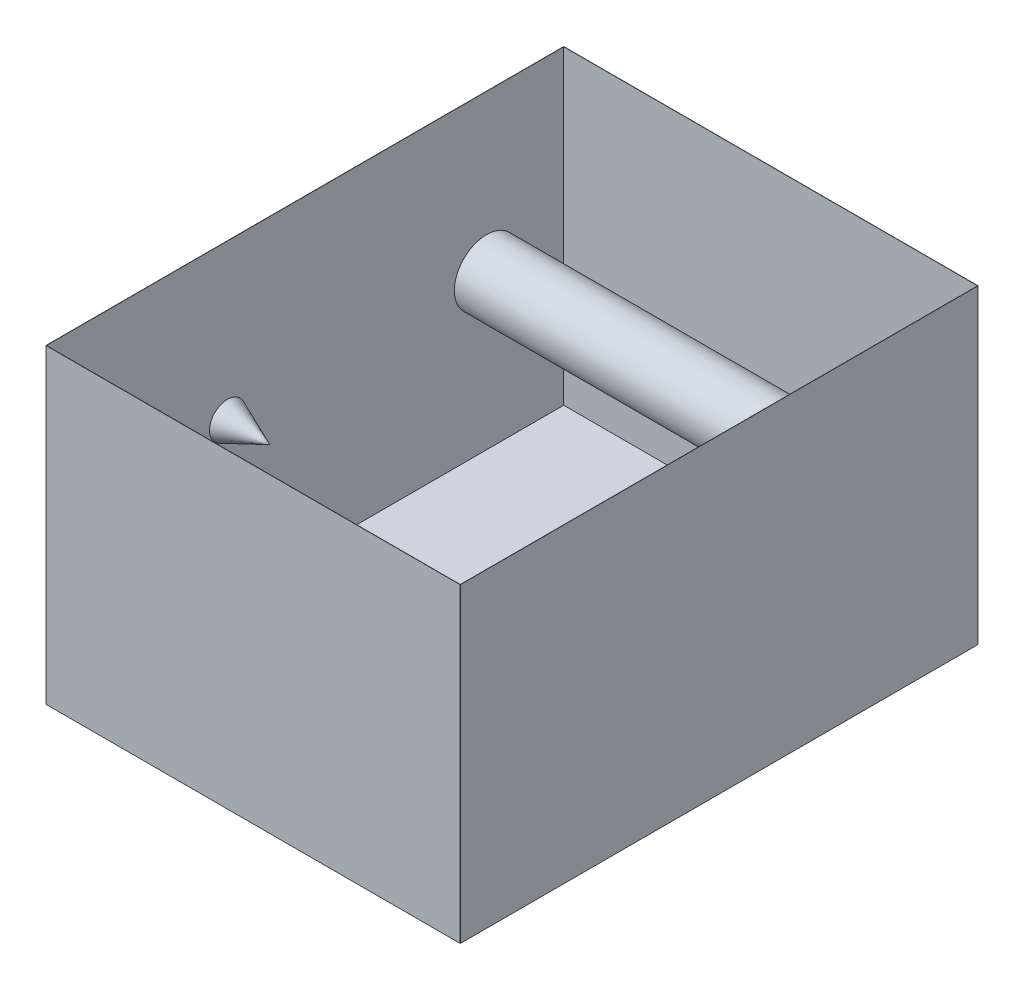
ISO-10303-21;
HEADER;
FILE_DESCRIPTION(('STEP AP214'),'2;1');
FILE_NAME('part.step','',(''),(''),'','','');
FILE_SCHEMA(('AUTOMOTIVE_DESIGN { 1 0 10303 214 1 1 1 1 }'));
ENDSEC;
DATA;
#1=APPLICATION_CONTEXT('core data for automotive mechanical design processes');
#2=APPLICATION_PROTOCOL_DEFINITION('international standard','automotive_design',2000,#1);
#3=PRODUCT_CONTEXT('',#1,'mechanical');
#4=PRODUCT('Part','Part','',(#3));
#5=PRODUCT_RELATED_PRODUCT_CATEGORY('part','',(#4));
#6=PRODUCT_DEFINITION_FORMATION('','',#4);
#7=PRODUCT_DEFINITION_CONTEXT('part definition',#1,'design');
#8=PRODUCT_DEFINITION('design','',#6,#7);
#9=PRODUCT_DEFINITION_SHAPE('','',#8);
#10=(LENGTH_UNIT() NAMED_UNIT(*) SI_UNIT(.MILLI.,.METRE.));
#11=(NAMED_UNIT(*) PLANE_ANGLE_UNIT() SI_UNIT($,.RADIAN.));
#12=(NAMED_UNIT(*) SI_UNIT($,.STERADIAN.) SOLID_ANGLE_UNIT());
#13=UNCERTAINTY_MEASURE_WITH_UNIT(LENGTH_MEASURE(1.E-05),#10,'distance_accuracy_value','');
#14=(GEOMETRIC_REPRESENTATION_CONTEXT(3) GLOBAL_UNCERTAINTY_ASSIGNED_CONTEXT((#13)) GLOBAL_UNIT_ASSIGNED_CONTEXT((#10,
#11,#12)) REPRESENTATION_CONTEXT('',''));
#15=CARTESIAN_POINT('',(0.,0.,0.));
#16=DIRECTION('',(0.,0.,1.));
#17=DIRECTION('',(1.,0.,0.));
#18=AXIS2_PLACEMENT_3D('',#15,#16,#17);
#19=CARTESIAN_POINT('',(80.,120.,-103.480281690141));
#20=DIRECTION('',(0.,0.,1.));
#21=DIRECTION('',(1.,0.,0.));
#22=AXIS2_PLACEMENT_3D('',#19,#20,#21);
#23=PLANE('',#22);
#24=DIRECTION('',(-1.,0.,0.));
#25=VECTOR('',#24,1.);
#26=CARTESIAN_POINT('',(80.,120.,-103.480281690141));
#27=LINE('',#26,#25);
#28=CARTESIAN_POINT('',(80.,120.,-103.480281690141));
#29=VERTEX_POINT('',#28);
#30=CARTESIAN_POINT('',(-80.,120.,-103.480281690141));
#31=VERTEX_POINT('',#30);
#32=EDGE_CURVE('E210',#29,#31,#27,.T.);
#33=ORIENTED_EDGE('',*,*,#32,.F.);
#34=DIRECTION('',(0.,-1.,0.));
#35=VECTOR('',#34,1.);
#36=CARTESIAN_POINT('',(80.,120.,-103.480281690141));
#37=LINE('',#36,#35);
#38=CARTESIAN_POINT('',(80.,-0.100000000000003,-103.480281690141));
#39=VERTEX_POINT('',#38);
#40=EDGE_CURVE('E50',#29,#39,#37,.T.);
#41=ORIENTED_EDGE('',*,*,#40,.T.);
#42=DIRECTION('',(-1.,0.,0.));
#43=VECTOR('',#42,1.);
#44=CARTESIAN_POINT('',(80.,-0.100000000000003,-103.480281690141));
#45=LINE('',#44,#43);
#46=CARTESIAN_POINT('',(-80.,-0.100000000000003,-103.480281690141));
#47=VERTEX_POINT('',#46);
#48=EDGE_CURVE('E195',#39,#47,#45,.T.);
#49=ORIENTED_EDGE('',*,*,#48,.T.);
#50=DIRECTION('',(0.,-1.,0.));
#51=VECTOR('',#50,1.);
#52=CARTESIAN_POINT('',(-80.,120.,-103.480281690141));
#53=LINE('',#52,#51);
#54=EDGE_CURVE('E271',#47,#31,#53,.F.);
#55=ORIENTED_EDGE('',*,*,#54,.T.);
#56=EDGE_LOOP('',(#33,#41,#49,#55));
#57=FACE_BOUND('',#56,.T.);
#58=ADVANCED_FACE('F41',(#57),#23,.F.);
#59=CARTESIAN_POINT('',(-80.1,120.,-103.380281690141));
#60=DIRECTION('',(1.,0.,0.));
#61=DIRECTION('',(0.,0.,-1.));
#62=AXIS2_PLACEMENT_3D('',#59,#60,#61);
#63=PLANE('',#62);
#64=DIRECTION('',(0.,0.,1.));
#65=VECTOR('',#64,1.);
#66=CARTESIAN_POINT('',(-80.1,-0.100000000000003,-103.380281690141));
#67=LINE('',#66,#65);
#68=CARTESIAN_POINT('',(-80.1,-0.100000000000003,-103.380281690141));
#69=VERTEX_POINT('',#68);
#70=CARTESIAN_POINT('',(-80.1,-0.100000000000003,96.6197183098592));
#71=VERTEX_POINT('',#70);
#72=EDGE_CURVE('E199',#69,#71,#67,.T.);
#73=ORIENTED_EDGE('',*,*,#72,.T.);
#74=DIRECTION('',(0.,-1.,0.));
#75=VECTOR('',#74,1.);
#76=CARTESIAN_POINT('',(-80.1,120.,96.6197183098592));
#77=LINE('',#76,#75);
#78=CARTESIAN_POINT('',(-80.1,120.,96.6197183098592));
#79=VERTEX_POINT('',#78);
#80=EDGE_CURVE('E57',#71,#79,#77,.F.);
#81=ORIENTED_EDGE('',*,*,#80,.T.);
#82=DIRECTION('',(0.,0.,1.));
#83=VECTOR('',#82,1.);
#84=CARTESIAN_POINT('',(-80.1,120.,-103.380281690141));
#85=LINE('',#84,#83);
#86=CARTESIAN_POINT('',(-80.1,120.,-103.380281690141));
#87=VERTEX_POINT('',#86);
#88=EDGE_CURVE('E213',#87,#79,#85,.T.);
#89=ORIENTED_EDGE('',*,*,#88,.F.);
#90=DIRECTION('',(0.,-1.,0.));
#91=VECTOR('',#90,1.);
#92=CARTESIAN_POINT('',(-80.1,120.,-103.380281690141));
#93=LINE('',#92,#91);
#94=EDGE_CURVE('E265',#87,#69,#93,.T.);
#95=ORIENTED_EDGE('',*,*,#94,.T.);
#96=EDGE_LOOP('',(#73,#81,#89,#95));
#97=FACE_BOUND('',#96,.T.);
#98=ADVANCED_FACE('F288',(#97),#63,.F.);
#99=CARTESIAN_POINT('',(-80.,120.,96.7197183098592));
#100=DIRECTION('',(0.,0.,-1.));
#101=DIRECTION('',(-1.,0.,0.));
#102=AXIS2_PLACEMENT_3D('',#99,#100,#101);
#103=PLANE('',#102);
#104=DIRECTION('',(1.,0.,0.));
#105=VECTOR('',#104,1.);
#106=CARTESIAN_POINT('',(-80.,-0.100000000000003,96.7197183098592));
#107=LINE('',#106,#105);
#108=CARTESIAN_POINT('',(-80.,-0.100000000000003,96.7197183098592));
#109=VERTEX_POINT('',#108);
#110=CARTESIAN_POINT('',(80.,-0.100000000000003,96.7197183098591));
#111=VERTEX_POINT('',#110);
#112=EDGE_CURVE('E202',#109,#111,#107,.T.);
#113=ORIENTED_EDGE('',*,*,#112,.T.);
#114=DIRECTION('',(0.,-1.,0.));
#115=VECTOR('',#114,1.);
#116=CARTESIAN_POINT('',(80.,120.,96.7197183098591));
#117=LINE('',#116,#115);
#118=CARTESIAN_POINT('',(80.,120.,96.7197183098591));
#119=VERTEX_POINT('',#118);
#120=EDGE_CURVE('E251',#111,#119,#117,.F.);
#121=ORIENTED_EDGE('',*,*,#120,.T.);
#122=DIRECTION('',(1.,0.,0.));
#123=VECTOR('',#122,1.);
#124=CARTESIAN_POINT('',(-80.,120.,96.7197183098592));
#125=LINE('',#124,#123);
#126=CARTESIAN_POINT('',(-80.,120.,96.7197183098592));
#127=VERTEX_POINT('',#126);
#128=EDGE_CURVE('E216',#127,#119,#125,.T.);
#129=ORIENTED_EDGE('',*,*,#128,.F.);
#130=DIRECTION('',(0.,-1.,0.));
#131=VECTOR('',#130,1.);
#132=CARTESIAN_POINT('',(-80.,120.,96.7197183098592));
#133=LINE('',#132,#131);
#134=EDGE_CURVE('E247',#127,#109,#133,.T.);
#135=ORIENTED_EDGE('',*,*,#134,.T.);
#136=EDGE_LOOP('',(#113,#121,#129,#135));
#137=FACE_BOUND('',#136,.T.);
#138=ADVANCED_FACE('F297',(#137),#103,.F.);
#139=CARTESIAN_POINT('',(80.1,120.,96.6197183098592));
#140=DIRECTION('',(-1.,0.,0.));
#141=DIRECTION('',(0.,0.,1.));
#142=AXIS2_PLACEMENT_3D('',#139,#140,#141);
#143=PLANE('',#142);
#144=DIRECTION('',(0.,0.,-1.));
#145=VECTOR('',#144,1.);
#146=CARTESIAN_POINT('',(80.1,120.,96.6197183098592));
#147=LINE('',#146,#145);
#148=CARTESIAN_POINT('',(80.1,120.,96.6197183098592));
#149=VERTEX_POINT('',#148);
#150=CARTESIAN_POINT('',(80.1,120.,-103.380281690141));
#151=VERTEX_POINT('',#150);
#152=EDGE_CURVE('E220',#149,#151,#147,.T.);
#153=ORIENTED_EDGE('',*,*,#152,.F.);
#154=DIRECTION('',(0.,-1.,0.));
#155=VECTOR('',#154,1.);
#156=CARTESIAN_POINT('',(80.1,120.,96.6197183098592));
#157=LINE('',#156,#155);
#158=CARTESIAN_POINT('',(80.1,-0.100000000000003,96.6197183098592));
#159=VERTEX_POINT('',#158);
#160=EDGE_CURVE('E231',#149,#159,#157,.T.);
#161=ORIENTED_EDGE('',*,*,#160,.T.);
#162=DIRECTION('',(0.,0.,-1.));
#163=VECTOR('',#162,1.);
#164=CARTESIAN_POINT('',(80.1,-0.100000000000003,96.6197183098592));
#165=LINE('',#164,#163);
#166=CARTESIAN_POINT('',(80.1,-0.100000000000003,-103.380281690141));
#167=VERTEX_POINT('',#166);
#168=EDGE_CURVE('E206',#159,#167,#165,.T.);
#169=ORIENTED_EDGE('',*,*,#168,.T.);
#170=DIRECTION('',(0.,-1.,0.));
#171=VECTOR('',#170,1.);
#172=CARTESIAN_POINT('',(80.1,120.,-103.380281690141));
#173=LINE('',#172,#171);
#174=EDGE_CURVE('E228',#167,#151,#173,.F.);
#175=ORIENTED_EDGE('',*,*,#174,.T.);
#176=EDGE_LOOP('',(#153,#161,#169,#175));
#177=FACE_BOUND('',#176,.T.);
#178=ADVANCED_FACE('F305',(#177),#143,.F.);
#179=CARTESIAN_POINT('',(0.,120.,0.));
#180=DIRECTION('',(0.,1.,0.));
#181=DIRECTION('',(0.,0.,1.));
#182=AXIS2_PLACEMENT_3D('',#179,#180,#181);
#183=PLANE('',#182);
#184=DIRECTION('',(-1.,0.,0.));
#185=VECTOR('',#184,1.);
#186=CARTESIAN_POINT('',(80.,120.,-103.380281690141));
#187=LINE('',#186,#185);
#188=CARTESIAN_POINT('',(80.,120.,-103.380281690141));
#189=VERTEX_POINT('',#188);
#190=CARTESIAN_POINT('',(-80.,120.,-103.380281690141));
#191=VERTEX_POINT('',#190);
#192=EDGE_CURVE('E154',#189,#191,#187,.T.);
#193=ORIENTED_EDGE('',*,*,#192,.F.);
#194=DIRECTION('',(0.,0.,-1.));
#195=VECTOR('',#194,1.);
#196=CARTESIAN_POINT('',(80.,120.,96.6197183098592));
#197=LINE('',#196,#195);
#198=CARTESIAN_POINT('',(80.,120.,96.6197183098592));
#199=VERTEX_POINT('',#198);
#200=EDGE_CURVE('E165',#199,#189,#197,.T.);
#201=ORIENTED_EDGE('',*,*,#200,.F.);
#202=DIRECTION('',(1.,0.,0.));
#203=VECTOR('',#202,1.);
#204=CARTESIAN_POINT('',(-80.,120.,96.6197183098592));
#205=LINE('',#204,#203);
#206=CARTESIAN_POINT('',(-80.,120.,96.6197183098592));
#207=VERTEX_POINT('',#206);
#208=EDGE_CURVE('E161',#207,#199,#205,.T.);
#209=ORIENTED_EDGE('',*,*,#208,.F.);
#210=DIRECTION('',(0.,0.,1.));
#211=VECTOR('',#210,1.);
#212=CARTESIAN_POINT('',(-80.,120.,-103.380281690141));
#213=LINE('',#212,#211);
#214=EDGE_CURVE('E157',#191,#207,#213,.T.);
#215=ORIENTED_EDGE('',*,*,#214,.F.);
#216=EDGE_LOOP('',(#193,#201,#209,#215));
#217=FACE_BOUND('',#216,.T.);
#218=ORIENTED_EDGE('',*,*,#128,.T.);
#219=CARTESIAN_POINT('',(80.,120.,96.6197183098592));
#220=DIRECTION('',(0.,1.,0.));
#221=DIRECTION('',(0.,0.,1.));
#222=AXIS2_PLACEMENT_3D('',#219,#220,#221);
#223=CIRCLE('',#222,0.1);
#224=EDGE_CURVE('E262',#119,#149,#223,.T.);
#225=ORIENTED_EDGE('',*,*,#224,.T.);
#226=ORIENTED_EDGE('',*,*,#152,.T.);
#227=CARTESIAN_POINT('',(80.,120.,-103.380281690141));
#228=DIRECTION('',(0.,1.,0.));
#229=DIRECTION('',(0.,0.,1.));
#230=AXIS2_PLACEMENT_3D('',#227,#228,#229);
#231=CIRCLE('',#230,0.1);
#232=EDGE_CURVE('E256',#151,#29,#231,.T.);
#233=ORIENTED_EDGE('',*,*,#232,.T.);
#234=ORIENTED_EDGE('',*,*,#32,.T.);
#235=CARTESIAN_POINT('',(-80.,120.,-103.380281690141));
#236=DIRECTION('',(0.,1.,0.));
#237=DIRECTION('',(0.,0.,1.));
#238=AXIS2_PLACEMENT_3D('',#235,#236,#237);
#239=CIRCLE('',#238,0.1);
#240=EDGE_CURVE('E64',#31,#87,#239,.T.);
#241=ORIENTED_EDGE('',*,*,#240,.T.);
#242=ORIENTED_EDGE('',*,*,#88,.T.);
#243=CARTESIAN_POINT('',(-80.,120.,96.6197183098592));
#244=DIRECTION('',(0.,1.,0.));
#245=DIRECTION('',(0.,0.,1.));
#246=AXIS2_PLACEMENT_3D('',#243,#244,#245);
#247=CIRCLE('',#246,0.1);
#248=EDGE_CURVE('E259',#79,#127,#247,.T.);
#249=ORIENTED_EDGE('',*,*,#248,.T.);
#250=EDGE_LOOP('',(#218,#225,#226,#233,#234,#241,#242,#249));
#251=FACE_BOUND('',#250,.T.);
#252=ADVANCED_FACE('F290',(#217,#251),#183,.T.);
#253=CARTESIAN_POINT('',(0.,-0.1,0.));
#254=DIRECTION('',(0.,1.,0.));
#255=DIRECTION('',(0.,0.,1.));
#256=AXIS2_PLACEMENT_3D('',#253,#254,#255);
#257=PLANE('',#256);
#258=ORIENTED_EDGE('',*,*,#168,.F.);
#259=CARTESIAN_POINT('',(80.,-0.100000000000003,96.6197183098592));
#260=DIRECTION('',(0.,1.,0.));
#261=DIRECTION('',(0.,0.,1.));
#262=AXIS2_PLACEMENT_3D('',#259,#260,#261);
#263=CIRCLE('',#262,0.1);
#264=EDGE_CURVE('E244',#159,#111,#263,.F.);
#265=ORIENTED_EDGE('',*,*,#264,.T.);
#266=ORIENTED_EDGE('',*,*,#112,.F.);
#267=CARTESIAN_POINT('',(-80.,-0.100000000000003,96.6197183098592));
#268=DIRECTION('',(0.,1.,0.));
#269=DIRECTION('',(0.,0.,1.));
#270=AXIS2_PLACEMENT_3D('',#267,#268,#269);
#271=CIRCLE('',#270,0.1);
#272=EDGE_CURVE('E241',#109,#71,#271,.F.);
#273=ORIENTED_EDGE('',*,*,#272,.T.);
#274=ORIENTED_EDGE('',*,*,#72,.F.);
#275=CARTESIAN_POINT('',(-80.,-0.100000000000003,-103.380281690141));
#276=DIRECTION('',(0.,1.,0.));
#277=DIRECTION('',(0.,0.,1.));
#278=AXIS2_PLACEMENT_3D('',#275,#276,#277);
#279=CIRCLE('',#278,0.1);
#280=EDGE_CURVE('E235',#69,#47,#279,.F.);
#281=ORIENTED_EDGE('',*,*,#280,.T.);
#282=ORIENTED_EDGE('',*,*,#48,.F.);
#283=CARTESIAN_POINT('',(80.,-0.100000000000003,-103.380281690141));
#284=DIRECTION('',(0.,1.,0.));
#285=DIRECTION('',(0.,0.,1.));
#286=AXIS2_PLACEMENT_3D('',#283,#284,#285);
#287=CIRCLE('',#286,0.1);
#288=EDGE_CURVE('E238',#39,#167,#287,.F.);
#289=ORIENTED_EDGE('',*,*,#288,.T.);
#290=EDGE_LOOP('',(#258,#265,#266,#273,#274,#281,#282,#289));
#291=FACE_BOUND('',#290,.T.);
#292=ADVANCED_FACE('F284',(#291),#257,.F.);
#293=CARTESIAN_POINT('',(80.,120.,-103.380281690141));
#294=DIRECTION('',(0.,0.,1.));
#295=DIRECTION('',(1.,0.,0.));
#296=AXIS2_PLACEMENT_3D('',#293,#294,#295);
#297=PLANE('',#296);
#298=DIRECTION('',(-1.,0.,0.));
#299=VECTOR('',#298,1.);
#300=CARTESIAN_POINT('',(80.,0.,-103.380281690141));
#301=LINE('',#300,#299);
#302=CARTESIAN_POINT('',(80.,0.,-103.380281690141));
#303=VERTEX_POINT('',#302);
#304=CARTESIAN_POINT('',(-80.,0.,-103.380281690141));
#305=VERTEX_POINT('',#304);
#306=EDGE_CURVE('E151',#303,#305,#301,.T.);
#307=ORIENTED_EDGE('',*,*,#306,.F.);
#308=DIRECTION('',(0.,-1.,0.));
#309=VECTOR('',#308,1.);
#310=CARTESIAN_POINT('',(80.,120.,-103.380281690141));
#311=LINE('',#310,#309);
#312=EDGE_CURVE('E168',#189,#303,#311,.T.);
#313=ORIENTED_EDGE('',*,*,#312,.F.);
#314=ORIENTED_EDGE('',*,*,#192,.T.);
#315=DIRECTION('',(0.,-1.,0.));
#316=VECTOR('',#315,1.);
#317=CARTESIAN_POINT('',(-80.,120.,-103.380281690141));
#318=LINE('',#317,#316);
#319=EDGE_CURVE('E191',#191,#305,#318,.T.);
#320=ORIENTED_EDGE('',*,*,#319,.T.);
#321=EDGE_LOOP('',(#307,#313,#314,#320));
#322=FACE_BOUND('',#321,.T.);
#323=ADVANCED_FACE('F331',(#322),#297,.T.);
#324=CARTESIAN_POINT('',(-80.,120.,-103.380281690141));
#325=DIRECTION('',(1.,0.,0.));
#326=DIRECTION('',(0.,0.,-1.));
#327=AXIS2_PLACEMENT_3D('',#324,#325,#326);
#328=PLANE('',#327);
#329=CARTESIAN_POINT('',(-80.,60.,26.6197183098592));
#330=DIRECTION('',(1.,0.,0.));
#331=DIRECTION('',(0.,0.,-1.));
#332=AXIS2_PLACEMENT_3D('',#329,#330,#331);
#333=CIRCLE('',#332,6.95755251837904);
#334=CARTESIAN_POINT('',(-80.,60.,19.6621657914801));
#335=VERTEX_POINT('',#334);
#336=EDGE_CURVE('E11',#335,#335,#333,.T.);
#337=ORIENTED_EDGE('',*,*,#336,.F.);
#338=EDGE_LOOP('',(#337));
#339=FACE_BOUND('',#338,.T.);
#340=DIRECTION('',(0.,0.,1.));
#341=VECTOR('',#340,1.);
#342=CARTESIAN_POINT('',(-80.,0.,-103.380281690141));
#343=LINE('',#342,#341);
#344=CARTESIAN_POINT('',(-80.,0.,96.6197183098592));
#345=VERTEX_POINT('',#344);
#346=EDGE_CURVE('E172',#305,#345,#343,.T.);
#347=ORIENTED_EDGE('',*,*,#346,.F.);
#348=ORIENTED_EDGE('',*,*,#319,.F.);
#349=ORIENTED_EDGE('',*,*,#214,.T.);
#350=DIRECTION('',(0.,-1.,0.));
#351=VECTOR('',#350,1.);
#352=CARTESIAN_POINT('',(-80.,120.,96.6197183098592));
#353=LINE('',#352,#351);
#354=EDGE_CURVE('E187',#207,#345,#353,.T.);
#355=ORIENTED_EDGE('',*,*,#354,.T.);
#356=EDGE_LOOP('',(#347,#348,#349,#355));
#357=FACE_BOUND('',#356,.T.);
#358=ADVANCED_FACE('F357',(#339,#357),#328,.T.);
#359=CARTESIAN_POINT('',(-80.,120.,96.6197183098592));
#360=DIRECTION('',(0.,0.,-1.));
#361=DIRECTION('',(-1.,0.,0.));
#362=AXIS2_PLACEMENT_3D('',#359,#360,#361);
#363=PLANE('',#362);
#364=DIRECTION('',(1.,0.,0.));
#365=VECTOR('',#364,1.);
#366=CARTESIAN_POINT('',(-80.,0.,96.6197183098592));
#367=LINE('',#366,#365);
#368=CARTESIAN_POINT('',(80.,0.,96.6197183098592));
#369=VERTEX_POINT('',#368);
#370=EDGE_CURVE('E175',#345,#369,#367,.T.);
#371=ORIENTED_EDGE('',*,*,#370,.F.);
#372=ORIENTED_EDGE('',*,*,#354,.F.);
#373=ORIENTED_EDGE('',*,*,#208,.T.);
#374=DIRECTION('',(0.,-1.,0.));
#375=VECTOR('',#374,1.);
#376=CARTESIAN_POINT('',(80.,120.,96.6197183098592));
#377=LINE('',#376,#375);
#378=EDGE_CURVE('E183',#199,#369,#377,.T.);
#379=ORIENTED_EDGE('',*,*,#378,.T.);
#380=EDGE_LOOP('',(#371,#372,#373,#379));
#381=FACE_BOUND('',#380,.T.);
#382=ADVANCED_FACE('F354',(#381),#363,.T.);
#383=CARTESIAN_POINT('',(80.,120.,96.6197183098592));
#384=DIRECTION('',(-1.,0.,0.));
#385=DIRECTION('',(0.,0.,1.));
#386=AXIS2_PLACEMENT_3D('',#383,#384,#385);
#387=PLANE('',#386);
#388=CARTESIAN_POINT('',(80.,60.,26.6197183098591));
#389=DIRECTION('',(-1.,0.,0.));
#390=DIRECTION('',(0.,0.,1.));
#391=AXIS2_PLACEMENT_3D('',#388,#389,#390);
#392=CIRCLE('',#391,7.);
#393=CARTESIAN_POINT('',(80.,60.,33.6197183098591));
#394=VERTEX_POINT('',#393);
#395=EDGE_CURVE('E144',#394,#394,#392,.T.);
#396=ORIENTED_EDGE('',*,*,#395,.F.);
#397=EDGE_LOOP('',(#396));
#398=FACE_BOUND('',#397,.T.);
#399=CARTESIAN_POINT('',(80.,59.6263905095299,-73.4802816901409));
#400=DIRECTION('',(-1.,0.,0.));
#401=DIRECTION('',(0.,0.,1.));
#402=AXIS2_PLACEMENT_3D('',#399,#400,#401);
#403=CIRCLE('',#402,12.5);
#404=CARTESIAN_POINT('',(80.,59.6263905095299,-60.9802816901409));
#405=VERTEX_POINT('',#404);
#406=EDGE_CURVE('E224',#405,#405,#403,.T.);
#407=ORIENTED_EDGE('',*,*,#406,.F.);
#408=EDGE_LOOP('',(#407));
#409=FACE_BOUND('',#408,.T.);
#410=DIRECTION('',(0.,0.,-1.));
#411=VECTOR('',#410,1.);
#412=CARTESIAN_POINT('',(80.,0.,96.6197183098592));
#413=LINE('',#412,#411);
#414=EDGE_CURVE('E158',#369,#303,#413,.T.);
#415=ORIENTED_EDGE('',*,*,#414,.F.);
#416=ORIENTED_EDGE('',*,*,#378,.F.);
#417=ORIENTED_EDGE('',*,*,#200,.T.);
#418=ORIENTED_EDGE('',*,*,#312,.T.);
#419=EDGE_LOOP('',(#415,#416,#417,#418));
#420=FACE_BOUND('',#419,.T.);
#421=ADVANCED_FACE('F350',(#398,#409,#420),#387,.T.);
#422=CARTESIAN_POINT('',(0.,0.,0.));
#423=DIRECTION('',(0.,1.,0.));
#424=DIRECTION('',(0.,0.,1.));
#425=AXIS2_PLACEMENT_3D('',#422,#423,#424);
#426=PLANE('',#425);
#427=ORIENTED_EDGE('',*,*,#306,.T.);
#428=ORIENTED_EDGE('',*,*,#346,.T.);
#429=ORIENTED_EDGE('',*,*,#370,.T.);
#430=ORIENTED_EDGE('',*,*,#414,.T.);
#431=EDGE_LOOP('',(#427,#428,#429,#430));
#432=FACE_BOUND('',#431,.T.);
#433=ADVANCED_FACE('F342',(#432),#426,.T.);
#434=CARTESIAN_POINT('',(-79.9,59.6263905095299,-73.4802816901408));
#435=DIRECTION('',(1.,0.,0.));
#436=DIRECTION('',(0.,0.,-1.));
#437=AXIS2_PLACEMENT_3D('',#434,#435,#436);
#438=CYLINDRICAL_SURFACE('',#437,12.5);
#439=ORIENTED_EDGE('',*,*,#406,.T.);
#440=EDGE_LOOP('',(#439));
#441=FACE_BOUND('',#440,.T.);
#442=CARTESIAN_POINT('',(-79.9,59.6263905095299,-73.4802816901408));
#443=DIRECTION('',(1.,0.,0.));
#444=DIRECTION('',(0.,0.,-1.));
#445=AXIS2_PLACEMENT_3D('',#442,#443,#444);
#446=CIRCLE('',#445,12.5);
#447=CARTESIAN_POINT('',(-79.9,59.6263905095299,-85.9802816901408));
#448=VERTEX_POINT('',#447);
#449=EDGE_CURVE('E147',#448,#448,#446,.T.);
#450=ORIENTED_EDGE('',*,*,#449,.T.);
#451=EDGE_LOOP('',(#450));
#452=FACE_BOUND('',#451,.T.);
#453=ADVANCED_FACE('F337',(#441,#452),#438,.T.);
#454=CARTESIAN_POINT('',(-79.9,59.6263905095299,-73.4802816901408));
#455=DIRECTION('',(1.,0.,0.));
#456=DIRECTION('',(0.,0.,-1.));
#457=AXIS2_PLACEMENT_3D('',#454,#455,#456);
#458=PLANE('',#457);
#459=ORIENTED_EDGE('',*,*,#449,.F.);
#460=EDGE_LOOP('',(#459));
#461=FACE_BOUND('',#460,.T.);
#462=ADVANCED_FACE('F333',(#461),#458,.F.);
#463=CARTESIAN_POINT('',(80.,120.,96.6197183098592));
#464=DIRECTION('',(0.,-1.,0.));
#465=DIRECTION('',(0.,0.,-1.));
#466=AXIS2_PLACEMENT_3D('',#463,#464,#465);
#467=CYLINDRICAL_SURFACE('',#466,0.1);
#468=ORIENTED_EDGE('',*,*,#224,.F.);
#469=ORIENTED_EDGE('',*,*,#120,.F.);
#470=ORIENTED_EDGE('',*,*,#264,.F.);
#471=ORIENTED_EDGE('',*,*,#160,.F.);
#472=EDGE_LOOP('',(#468,#469,#470,#471));
#473=FACE_BOUND('',#472,.T.);
#474=ADVANCED_FACE('F302',(#473),#467,.T.);
#475=CARTESIAN_POINT('',(-80.,120.,96.6197183098592));
#476=DIRECTION('',(0.,-1.,0.));
#477=DIRECTION('',(0.,0.,-1.));
#478=AXIS2_PLACEMENT_3D('',#475,#476,#477);
#479=CYLINDRICAL_SURFACE('',#478,0.1);
#480=ORIENTED_EDGE('',*,*,#248,.F.);
#481=ORIENTED_EDGE('',*,*,#80,.F.);
#482=ORIENTED_EDGE('',*,*,#272,.F.);
#483=ORIENTED_EDGE('',*,*,#134,.F.);
#484=EDGE_LOOP('',(#480,#481,#482,#483));
#485=FACE_BOUND('',#484,.T.);
#486=ADVANCED_FACE('F294',(#485),#479,.T.);
#487=CARTESIAN_POINT('',(80.,120.,-103.380281690141));
#488=DIRECTION('',(0.,-1.,0.));
#489=DIRECTION('',(0.,0.,-1.));
#490=AXIS2_PLACEMENT_3D('',#487,#488,#489);
#491=CYLINDRICAL_SURFACE('',#490,0.1);
#492=ORIENTED_EDGE('',*,*,#232,.F.);
#493=ORIENTED_EDGE('',*,*,#174,.F.);
#494=ORIENTED_EDGE('',*,*,#288,.F.);
#495=ORIENTED_EDGE('',*,*,#40,.F.);
#496=EDGE_LOOP('',(#492,#493,#494,#495));
#497=FACE_BOUND('',#496,.T.);
#498=ADVANCED_FACE('F307',(#497),#491,.T.);
#499=CARTESIAN_POINT('',(-80.,120.,-103.380281690141));
#500=DIRECTION('',(0.,-1.,0.));
#501=DIRECTION('',(0.,0.,-1.));
#502=AXIS2_PLACEMENT_3D('',#499,#500,#501);
#503=CYLINDRICAL_SURFACE('',#502,0.1);
#504=ORIENTED_EDGE('',*,*,#240,.F.);
#505=ORIENTED_EDGE('',*,*,#54,.F.);
#506=ORIENTED_EDGE('',*,*,#280,.F.);
#507=ORIENTED_EDGE('',*,*,#94,.F.);
#508=EDGE_LOOP('',(#504,#505,#506,#507));
#509=FACE_BOUND('',#508,.T.);
#510=ADVANCED_FACE('F43',(#509),#503,.T.);
#511=CARTESIAN_POINT('',(-80.1,60.,26.6197183098592));
#512=DIRECTION('',(-1.,0.,0.));
#513=DIRECTION('',(0.,0.,1.));
#514=AXIS2_PLACEMENT_3D('',#511,#512,#513);
#515=CONICAL_SURFACE('',#514,7.,0.401425727958696);
#516=ORIENTED_EDGE('',*,*,#336,.T.);
#517=EDGE_LOOP('',(#516));
#518=FACE_BOUND('',#517,.T.);
#519=CARTESIAN_POINT('',(-63.6090334392337,60.,26.6197183098592));
#520=VERTEX_POINT('',#519);
#521=VERTEX_LOOP('',#520);
#522=FACE_BOUND('',#521,.T.);
#523=ADVANCED_FACE('F140',(#518,#522),#515,.T.);
#524=CARTESIAN_POINT('',(80.,60.,26.6197183098591));
#525=DIRECTION('',(1.,0.,0.));
#526=DIRECTION('',(0.,0.,1.));
#527=AXIS2_PLACEMENT_3D('',#524,#525,#526);
#528=CONICAL_SURFACE('',#527,7.,0.401425727958696);
#529=CARTESIAN_POINT('',(63.5090334392338,60.,26.6197183098591));
#530=VERTEX_POINT('',#529);
#531=VERTEX_LOOP('',#530);
#532=FACE_BOUND('',#531,.T.);
#533=ORIENTED_EDGE('',*,*,#395,.T.);
#534=EDGE_LOOP('',(#533));
#535=FACE_BOUND('',#534,.T.);
#536=ADVANCED_FACE('F137',(#532,#535),#528,.T.);
#537=CLOSED_SHELL('',(#58,#98,#138,#178,#252,#292,#323,#358,#382,#421,#433,#453,#462,#474,#486,
#498,#510,#523,#536));
#538=MANIFOLD_SOLID_BREP('B2',#537);
#539=ADVANCED_BREP_SHAPE_REPRESENTATION('',(#18,#538),#14);
#540=SHAPE_DEFINITION_REPRESENTATION(#9,#539);
ENDSEC;
END-ISO-10303-21;
